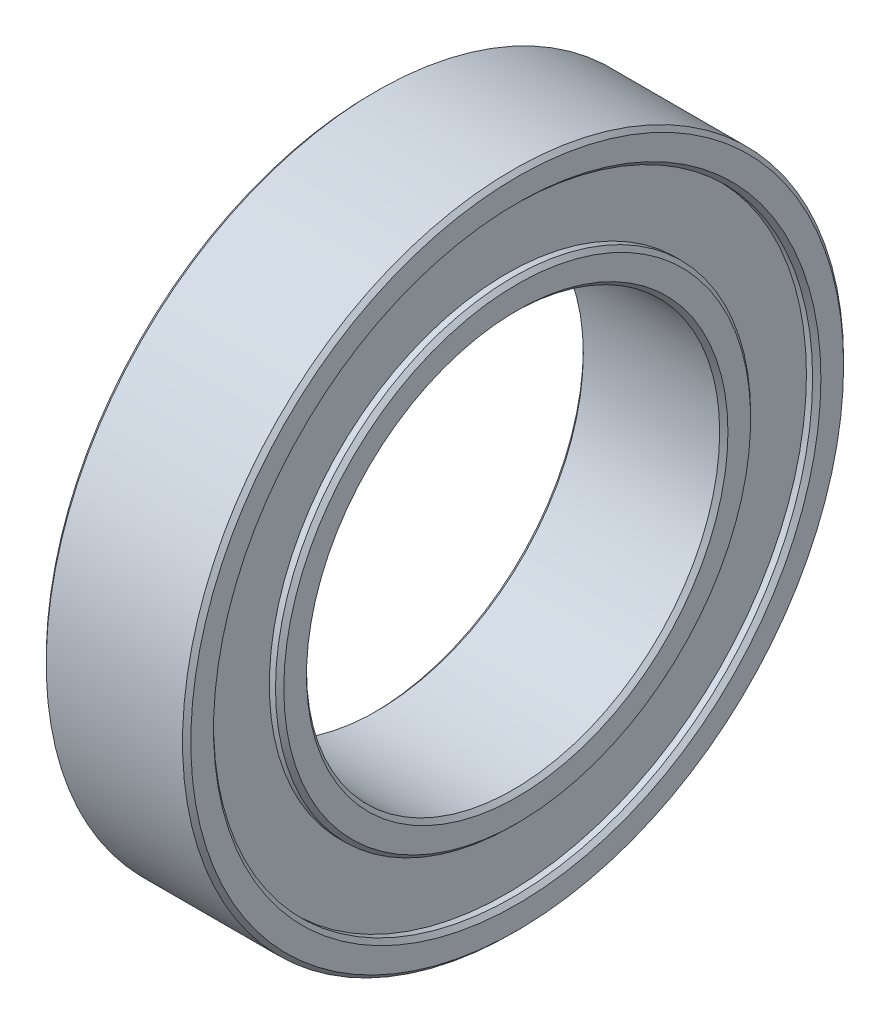
ISO-10303-21;
HEADER;
FILE_DESCRIPTION(('STEP AP214'),'2;1');
FILE_NAME('part.step','',(''),(''),'','','');
FILE_SCHEMA(('AUTOMOTIVE_DESIGN { 1 0 10303 214 1 1 1 1 }'));
ENDSEC;
DATA;
#1=APPLICATION_CONTEXT('core data for automotive mechanical design processes');
#2=APPLICATION_PROTOCOL_DEFINITION('international standard','automotive_design',2000,#1);
#3=PRODUCT_CONTEXT('',#1,'mechanical');
#4=PRODUCT('Part','Part','',(#3));
#5=PRODUCT_RELATED_PRODUCT_CATEGORY('part','',(#4));
#6=PRODUCT_DEFINITION_FORMATION('','',#4);
#7=PRODUCT_DEFINITION_CONTEXT('part definition',#1,'design');
#8=PRODUCT_DEFINITION('design','',#6,#7);
#9=PRODUCT_DEFINITION_SHAPE('','',#8);
#10=(LENGTH_UNIT() NAMED_UNIT(*) SI_UNIT(.MILLI.,.METRE.));
#11=(NAMED_UNIT(*) PLANE_ANGLE_UNIT() SI_UNIT($,.RADIAN.));
#12=(NAMED_UNIT(*) SI_UNIT($,.STERADIAN.) SOLID_ANGLE_UNIT());
#13=UNCERTAINTY_MEASURE_WITH_UNIT(LENGTH_MEASURE(1.E-05),#10,'distance_accuracy_value','');
#14=(GEOMETRIC_REPRESENTATION_CONTEXT(3) GLOBAL_UNCERTAINTY_ASSIGNED_CONTEXT((#13)) GLOBAL_UNIT_ASSIGNED_CONTEXT((#10,
#11,#12)) REPRESENTATION_CONTEXT('',''));
#15=CARTESIAN_POINT('',(0.,0.,0.));
#16=DIRECTION('',(0.,0.,1.));
#17=DIRECTION('',(1.,0.,0.));
#18=AXIS2_PLACEMENT_3D('',#15,#16,#17);
#19=CARTESIAN_POINT('',(-3.5,0.,0.));
#20=DIRECTION('',(1.,0.,0.));
#21=DIRECTION('',(0.,0.,-1.));
#22=AXIS2_PLACEMENT_3D('',#19,#20,#21);
#23=PLANE('',#22);
#24=CARTESIAN_POINT('',(-3.5,0.,0.));
#25=DIRECTION('',(1.,0.,0.));
#26=DIRECTION('',(0.,0.,-1.));
#27=AXIS2_PLACEMENT_3D('',#24,#25,#26);
#28=CIRCLE('',#27,11.3);
#29=CARTESIAN_POINT('',(-3.5,0.,-11.3));
#30=VERTEX_POINT('',#29);
#31=EDGE_CURVE('E100',#30,#30,#28,.F.);
#32=ORIENTED_EDGE('',*,*,#31,.T.);
#33=EDGE_LOOP('',(#32));
#34=FACE_BOUND('',#33,.T.);
#35=CARTESIAN_POINT('',(-3.5,0.,0.));
#36=DIRECTION('',(1.,0.,0.));
#37=DIRECTION('',(0.,0.,-1.));
#38=AXIS2_PLACEMENT_3D('',#35,#36,#37);
#39=CIRCLE('',#38,10.2);
#40=CARTESIAN_POINT('',(-3.5,0.,-10.2));
#41=VERTEX_POINT('',#40);
#42=EDGE_CURVE('E104',#41,#41,#39,.T.);
#43=ORIENTED_EDGE('',*,*,#42,.T.);
#44=EDGE_LOOP('',(#43));
#45=FACE_BOUND('',#44,.T.);
#46=ADVANCED_FACE('F39',(#34,#45),#23,.F.);
#47=CARTESIAN_POINT('',(3.5,0.,0.));
#48=DIRECTION('',(1.,0.,0.));
#49=DIRECTION('',(0.,0.,-1.));
#50=AXIS2_PLACEMENT_3D('',#47,#48,#49);
#51=PLANE('',#50);
#52=CARTESIAN_POINT('',(3.5,0.,0.));
#53=DIRECTION('',(1.,0.,0.));
#54=DIRECTION('',(0.,0.,-1.));
#55=AXIS2_PLACEMENT_3D('',#52,#53,#54);
#56=CIRCLE('',#55,11.3);
#57=CARTESIAN_POINT('',(3.5,0.,11.3));
#58=VERTEX_POINT('',#57);
#59=EDGE_CURVE('E64',#58,#58,#56,.T.);
#60=ORIENTED_EDGE('',*,*,#59,.T.);
#61=EDGE_LOOP('',(#60));
#62=FACE_BOUND('',#61,.T.);
#63=CARTESIAN_POINT('',(3.5,0.,0.));
#64=DIRECTION('',(1.,0.,0.));
#65=DIRECTION('',(0.,0.,-1.));
#66=AXIS2_PLACEMENT_3D('',#63,#64,#65);
#67=CIRCLE('',#66,10.2);
#68=CARTESIAN_POINT('',(3.5,0.,-10.2));
#69=VERTEX_POINT('',#68);
#70=EDGE_CURVE('E68',#69,#69,#67,.F.);
#71=ORIENTED_EDGE('',*,*,#70,.T.);
#72=EDGE_LOOP('',(#71));
#73=FACE_BOUND('',#72,.T.);
#74=ADVANCED_FACE('F148',(#62,#73),#51,.T.);
#75=CARTESIAN_POINT('',(3.5,0.,0.));
#76=DIRECTION('',(1.,0.,0.));
#77=DIRECTION('',(0.,0.,-1.));
#78=AXIS2_PLACEMENT_3D('',#75,#76,#77);
#79=CIRCLE('',#78,15.8);
#80=CARTESIAN_POINT('',(3.5,0.,-15.8));
#81=VERTEX_POINT('',#80);
#82=EDGE_CURVE('E48',#81,#81,#79,.T.);
#83=ORIENTED_EDGE('',*,*,#82,.T.);
#84=EDGE_LOOP('',(#83));
#85=FACE_BOUND('',#84,.T.);
#86=CARTESIAN_POINT('',(3.5,0.,0.));
#87=DIRECTION('',(1.,0.,0.));
#88=DIRECTION('',(0.,0.,-1.));
#89=AXIS2_PLACEMENT_3D('',#86,#87,#88);
#90=CIRCLE('',#89,14.7);
#91=CARTESIAN_POINT('',(3.5,0.,-14.7));
#92=VERTEX_POINT('',#91);
#93=EDGE_CURVE('E53',#92,#92,#90,.F.);
#94=ORIENTED_EDGE('',*,*,#93,.T.);
#95=EDGE_LOOP('',(#94));
#96=FACE_BOUND('',#95,.T.);
#97=ADVANCED_FACE('F155',(#85,#96),#51,.T.);
#98=CARTESIAN_POINT('',(-3.5,0.,0.));
#99=DIRECTION('',(1.,0.,0.));
#100=DIRECTION('',(0.,0.,-1.));
#101=AXIS2_PLACEMENT_3D('',#98,#99,#100);
#102=CIRCLE('',#101,15.8);
#103=CARTESIAN_POINT('',(-3.5,0.,-15.8));
#104=VERTEX_POINT('',#103);
#105=EDGE_CURVE('E76',#104,#104,#102,.F.);
#106=ORIENTED_EDGE('',*,*,#105,.T.);
#107=EDGE_LOOP('',(#106));
#108=FACE_BOUND('',#107,.T.);
#109=CARTESIAN_POINT('',(-3.5,0.,0.));
#110=DIRECTION('',(1.,0.,0.));
#111=DIRECTION('',(0.,0.,-1.));
#112=AXIS2_PLACEMENT_3D('',#109,#110,#111);
#113=CIRCLE('',#112,14.7);
#114=CARTESIAN_POINT('',(-3.5,0.,-14.7));
#115=VERTEX_POINT('',#114);
#116=EDGE_CURVE('E80',#115,#115,#113,.T.);
#117=ORIENTED_EDGE('',*,*,#116,.T.);
#118=EDGE_LOOP('',(#117));
#119=FACE_BOUND('',#118,.T.);
#120=ADVANCED_FACE('F151',(#108,#119),#23,.F.);
#121=CARTESIAN_POINT('',(3.5,0.,0.));
#122=DIRECTION('',(-1.,0.,0.));
#123=DIRECTION('',(0.,0.,1.));
#124=AXIS2_PLACEMENT_3D('',#121,#122,#123);
#125=CYLINDRICAL_SURFACE('',#124,16.);
#126=CARTESIAN_POINT('',(-3.3,0.,0.));
#127=DIRECTION('',(1.,0.,0.));
#128=DIRECTION('',(0.,0.,-1.));
#129=AXIS2_PLACEMENT_3D('',#126,#127,#128);
#130=CIRCLE('',#129,16.);
#131=CARTESIAN_POINT('',(-3.3,0.,-16.));
#132=VERTEX_POINT('',#131);
#133=EDGE_CURVE('E84',#132,#132,#130,.T.);
#134=ORIENTED_EDGE('',*,*,#133,.T.);
#135=EDGE_LOOP('',(#134));
#136=FACE_BOUND('',#135,.T.);
#137=CARTESIAN_POINT('',(3.29999999999999,0.,0.));
#138=DIRECTION('',(1.,0.,0.));
#139=DIRECTION('',(0.,0.,-1.));
#140=AXIS2_PLACEMENT_3D('',#137,#138,#139);
#141=CIRCLE('',#140,16.);
#142=CARTESIAN_POINT('',(3.29999999999999,0.,-16.));
#143=VERTEX_POINT('',#142);
#144=EDGE_CURVE('E88',#143,#143,#141,.F.);
#145=ORIENTED_EDGE('',*,*,#144,.T.);
#146=EDGE_LOOP('',(#145));
#147=FACE_BOUND('',#146,.T.);
#148=ADVANCED_FACE('F161',(#136,#147),#125,.T.);
#149=CARTESIAN_POINT('',(3.5,0.,0.));
#150=DIRECTION('',(-1.,0.,0.));
#151=DIRECTION('',(0.,0.,1.));
#152=AXIS2_PLACEMENT_3D('',#149,#150,#151);
#153=CYLINDRICAL_SURFACE('',#152,10.);
#154=CARTESIAN_POINT('',(-3.3,0.,0.));
#155=DIRECTION('',(1.,0.,0.));
#156=DIRECTION('',(0.,0.,-1.));
#157=AXIS2_PLACEMENT_3D('',#154,#155,#156);
#158=CIRCLE('',#157,10.);
#159=CARTESIAN_POINT('',(-3.3,0.,-10.));
#160=VERTEX_POINT('',#159);
#161=EDGE_CURVE('E92',#160,#160,#158,.F.);
#162=ORIENTED_EDGE('',*,*,#161,.T.);
#163=EDGE_LOOP('',(#162));
#164=FACE_BOUND('',#163,.T.);
#165=CARTESIAN_POINT('',(3.29999999999999,0.,0.));
#166=DIRECTION('',(1.,0.,0.));
#167=DIRECTION('',(0.,0.,-1.));
#168=AXIS2_PLACEMENT_3D('',#165,#166,#167);
#169=CIRCLE('',#168,10.);
#170=CARTESIAN_POINT('',(3.29999999999999,0.,-10.));
#171=VERTEX_POINT('',#170);
#172=EDGE_CURVE('E96',#171,#171,#169,.T.);
#173=ORIENTED_EDGE('',*,*,#172,.T.);
#174=EDGE_LOOP('',(#173));
#175=FACE_BOUND('',#174,.T.);
#176=ADVANCED_FACE('F167',(#164,#175),#153,.F.);
#177=CARTESIAN_POINT('',(3.,0.,0.));
#178=DIRECTION('',(1.,0.,0.));
#179=DIRECTION('',(0.,0.,-1.));
#180=AXIS2_PLACEMENT_3D('',#177,#178,#179);
#181=CYLINDRICAL_SURFACE('',#180,14.5);
#182=CARTESIAN_POINT('',(3.3,0.,0.));
#183=DIRECTION('',(1.,0.,0.));
#184=DIRECTION('',(0.,0.,-1.));
#185=AXIS2_PLACEMENT_3D('',#182,#183,#184);
#186=CIRCLE('',#185,14.5);
#187=CARTESIAN_POINT('',(3.3,0.,-14.5));
#188=VERTEX_POINT('',#187);
#189=EDGE_CURVE('E10',#188,#188,#186,.T.);
#190=ORIENTED_EDGE('',*,*,#189,.T.);
#191=EDGE_LOOP('',(#190));
#192=FACE_BOUND('',#191,.T.);
#193=CARTESIAN_POINT('',(3.,0.,0.));
#194=DIRECTION('',(1.,0.,0.));
#195=DIRECTION('',(0.,0.,-1.));
#196=AXIS2_PLACEMENT_3D('',#193,#194,#195);
#197=CIRCLE('',#196,14.5);
#198=CARTESIAN_POINT('',(3.,0.,-14.5));
#199=VERTEX_POINT('',#198);
#200=EDGE_CURVE('E112',#199,#199,#197,.T.);
#201=ORIENTED_EDGE('',*,*,#200,.F.);
#202=EDGE_LOOP('',(#201));
#203=FACE_BOUND('',#202,.T.);
#204=ADVANCED_FACE('F292',(#192,#203),#181,.F.);
#205=CARTESIAN_POINT('',(3.,0.,0.));
#206=DIRECTION('',(1.,0.,0.));
#207=DIRECTION('',(0.,0.,-1.));
#208=AXIS2_PLACEMENT_3D('',#205,#206,#207);
#209=PLANE('',#208);
#210=CARTESIAN_POINT('',(3.,0.,0.));
#211=DIRECTION('',(1.,0.,0.));
#212=DIRECTION('',(0.,0.,-1.));
#213=AXIS2_PLACEMENT_3D('',#210,#211,#212);
#214=CIRCLE('',#213,11.5);
#215=CARTESIAN_POINT('',(3.,0.,-11.5));
#216=VERTEX_POINT('',#215);
#217=EDGE_CURVE('E116',#216,#216,#214,.T.);
#218=ORIENTED_EDGE('',*,*,#217,.F.);
#219=EDGE_LOOP('',(#218));
#220=FACE_BOUND('',#219,.T.);
#221=ORIENTED_EDGE('',*,*,#200,.T.);
#222=EDGE_LOOP('',(#221));
#223=FACE_BOUND('',#222,.T.);
#224=ADVANCED_FACE('F283',(#220,#223),#209,.T.);
#225=CARTESIAN_POINT('',(3.,0.,0.));
#226=DIRECTION('',(1.,0.,0.));
#227=DIRECTION('',(0.,0.,-1.));
#228=AXIS2_PLACEMENT_3D('',#225,#226,#227);
#229=CYLINDRICAL_SURFACE('',#228,11.5);
#230=CARTESIAN_POINT('',(3.29999999999999,0.,0.));
#231=DIRECTION('',(1.,0.,0.));
#232=DIRECTION('',(0.,0.,-1.));
#233=AXIS2_PLACEMENT_3D('',#230,#231,#232);
#234=CIRCLE('',#233,11.5);
#235=CARTESIAN_POINT('',(3.29999999999999,0.,11.5));
#236=VERTEX_POINT('',#235);
#237=EDGE_CURVE('E58',#236,#236,#234,.F.);
#238=ORIENTED_EDGE('',*,*,#237,.T.);
#239=EDGE_LOOP('',(#238));
#240=FACE_BOUND('',#239,.T.);
#241=ORIENTED_EDGE('',*,*,#217,.T.);
#242=EDGE_LOOP('',(#241));
#243=FACE_BOUND('',#242,.T.);
#244=ADVANCED_FACE('F278',(#240,#243),#229,.T.);
#245=CARTESIAN_POINT('',(-3.,0.,0.));
#246=DIRECTION('',(-1.,0.,0.));
#247=DIRECTION('',(0.,0.,-1.));
#248=AXIS2_PLACEMENT_3D('',#245,#246,#247);
#249=PLANE('',#248);
#250=CARTESIAN_POINT('',(-3.,0.,0.));
#251=DIRECTION('',(1.,0.,0.));
#252=DIRECTION('',(0.,0.,-1.));
#253=AXIS2_PLACEMENT_3D('',#250,#251,#252);
#254=CIRCLE('',#253,14.5);
#255=CARTESIAN_POINT('',(-3.,0.,-14.5));
#256=VERTEX_POINT('',#255);
#257=EDGE_CURVE('E120',#256,#256,#254,.T.);
#258=ORIENTED_EDGE('',*,*,#257,.F.);
#259=EDGE_LOOP('',(#258));
#260=FACE_BOUND('',#259,.T.);
#261=CARTESIAN_POINT('',(-3.,0.,0.));
#262=DIRECTION('',(1.,0.,0.));
#263=DIRECTION('',(0.,0.,-1.));
#264=AXIS2_PLACEMENT_3D('',#261,#262,#263);
#265=CIRCLE('',#264,11.5);
#266=CARTESIAN_POINT('',(-3.,0.,-11.5));
#267=VERTEX_POINT('',#266);
#268=EDGE_CURVE('E124',#267,#267,#265,.T.);
#269=ORIENTED_EDGE('',*,*,#268,.T.);
#270=EDGE_LOOP('',(#269));
#271=FACE_BOUND('',#270,.T.);
#272=ADVANCED_FACE('F129',(#260,#271),#249,.T.);
#273=CARTESIAN_POINT('',(-3.,0.,0.));
#274=DIRECTION('',(-1.,0.,0.));
#275=DIRECTION('',(0.,0.,1.));
#276=AXIS2_PLACEMENT_3D('',#273,#274,#275);
#277=CYLINDRICAL_SURFACE('',#276,14.5);
#278=CARTESIAN_POINT('',(-3.3,0.,0.));
#279=DIRECTION('',(1.,0.,0.));
#280=DIRECTION('',(0.,0.,-1.));
#281=AXIS2_PLACEMENT_3D('',#278,#279,#280);
#282=CIRCLE('',#281,14.5);
#283=CARTESIAN_POINT('',(-3.3,0.,-14.5));
#284=VERTEX_POINT('',#283);
#285=EDGE_CURVE('E72',#284,#284,#282,.F.);
#286=ORIENTED_EDGE('',*,*,#285,.T.);
#287=EDGE_LOOP('',(#286));
#288=FACE_BOUND('',#287,.T.);
#289=ORIENTED_EDGE('',*,*,#257,.T.);
#290=EDGE_LOOP('',(#289));
#291=FACE_BOUND('',#290,.T.);
#292=ADVANCED_FACE('F134',(#288,#291),#277,.F.);
#293=CARTESIAN_POINT('',(-3.,0.,0.));
#294=DIRECTION('',(-1.,0.,0.));
#295=DIRECTION('',(0.,0.,1.));
#296=AXIS2_PLACEMENT_3D('',#293,#294,#295);
#297=CYLINDRICAL_SURFACE('',#296,11.5);
#298=CARTESIAN_POINT('',(-3.3,0.,0.));
#299=DIRECTION('',(1.,0.,0.));
#300=DIRECTION('',(0.,0.,-1.));
#301=AXIS2_PLACEMENT_3D('',#298,#299,#300);
#302=CIRCLE('',#301,11.5);
#303=CARTESIAN_POINT('',(-3.3,0.,-11.5));
#304=VERTEX_POINT('',#303);
#305=EDGE_CURVE('E108',#304,#304,#302,.T.);
#306=ORIENTED_EDGE('',*,*,#305,.T.);
#307=EDGE_LOOP('',(#306));
#308=FACE_BOUND('',#307,.T.);
#309=ORIENTED_EDGE('',*,*,#268,.F.);
#310=EDGE_LOOP('',(#309));
#311=FACE_BOUND('',#310,.T.);
#312=ADVANCED_FACE('F131',(#308,#311),#297,.T.);
#313=CARTESIAN_POINT('',(-3.3,0.,0.));
#314=DIRECTION('',(1.,0.,0.));
#315=DIRECTION('',(0.,0.,-1.));
#316=AXIS2_PLACEMENT_3D('',#313,#314,#315);
#317=CONICAL_SURFACE('',#316,11.5,0.785398163397453);
#318=ORIENTED_EDGE('',*,*,#31,.F.);
#319=EDGE_LOOP('',(#318));
#320=FACE_BOUND('',#319,.T.);
#321=ORIENTED_EDGE('',*,*,#305,.F.);
#322=EDGE_LOOP('',(#321));
#323=FACE_BOUND('',#322,.T.);
#324=ADVANCED_FACE('F133',(#320,#323),#317,.T.);
#325=CARTESIAN_POINT('',(-3.5,0.,0.));
#326=DIRECTION('',(-1.,0.,0.));
#327=DIRECTION('',(0.,0.,1.));
#328=AXIS2_PLACEMENT_3D('',#325,#326,#327);
#329=CONICAL_SURFACE('',#328,10.2,0.785398163397448);
#330=ORIENTED_EDGE('',*,*,#161,.F.);
#331=EDGE_LOOP('',(#330));
#332=FACE_BOUND('',#331,.T.);
#333=ORIENTED_EDGE('',*,*,#42,.F.);
#334=EDGE_LOOP('',(#333));
#335=FACE_BOUND('',#334,.T.);
#336=ADVANCED_FACE('F141',(#332,#335),#329,.F.);
#337=CARTESIAN_POINT('',(-3.3,0.,0.));
#338=DIRECTION('',(1.,0.,0.));
#339=DIRECTION('',(0.,0.,-1.));
#340=AXIS2_PLACEMENT_3D('',#337,#338,#339);
#341=CONICAL_SURFACE('',#340,16.,0.785398163397448);
#342=ORIENTED_EDGE('',*,*,#105,.F.);
#343=EDGE_LOOP('',(#342));
#344=FACE_BOUND('',#343,.T.);
#345=ORIENTED_EDGE('',*,*,#133,.F.);
#346=EDGE_LOOP('',(#345));
#347=FACE_BOUND('',#346,.T.);
#348=ADVANCED_FACE('F176',(#344,#347),#341,.T.);
#349=CARTESIAN_POINT('',(-3.5,0.,0.));
#350=DIRECTION('',(-1.,0.,0.));
#351=DIRECTION('',(0.,0.,1.));
#352=AXIS2_PLACEMENT_3D('',#349,#350,#351);
#353=CONICAL_SURFACE('',#352,14.7,0.785398163397457);
#354=ORIENTED_EDGE('',*,*,#285,.F.);
#355=EDGE_LOOP('',(#354));
#356=FACE_BOUND('',#355,.T.);
#357=ORIENTED_EDGE('',*,*,#116,.F.);
#358=EDGE_LOOP('',(#357));
#359=FACE_BOUND('',#358,.T.);
#360=ADVANCED_FACE('F173',(#356,#359),#353,.F.);
#361=CARTESIAN_POINT('',(3.5,0.,0.));
#362=DIRECTION('',(-1.,0.,0.));
#363=DIRECTION('',(0.,0.,1.));
#364=AXIS2_PLACEMENT_3D('',#361,#362,#363);
#365=CONICAL_SURFACE('',#364,11.3,0.785398163397444);
#366=CARTESIAN_POINT('',(3.29999999999999,0.,11.5));
#367=CARTESIAN_POINT('',(3.30208333333332,0.,11.4979166666667));
#368=CARTESIAN_POINT('',(3.30416666666666,0.,11.4958333333333));
#369=CARTESIAN_POINT('',(3.30833333333332,0.,11.4916666666667));
#370=CARTESIAN_POINT('',(3.31041666666666,0.,11.4895833333333));
#371=CARTESIAN_POINT('',(3.31458333333332,0.,11.4854166666667));
#372=CARTESIAN_POINT('',(3.31666666666666,0.,11.4833333333333));
#373=CARTESIAN_POINT('',(3.32083333333332,0.,11.4791666666667));
#374=CARTESIAN_POINT('',(3.32291666666666,0.,11.4770833333333));
#375=CARTESIAN_POINT('',(3.32708333333332,0.,11.4729166666667));
#376=CARTESIAN_POINT('',(3.32916666666666,0.,11.4708333333333));
#377=CARTESIAN_POINT('',(3.33333333333332,0.,11.4666666666667));
#378=CARTESIAN_POINT('',(3.33541666666666,0.,11.4645833333333));
#379=CARTESIAN_POINT('',(3.33958333333332,0.,11.4604166666667));
#380=CARTESIAN_POINT('',(3.34166666666666,0.,11.4583333333333));
#381=CARTESIAN_POINT('',(3.34583333333332,0.,11.4541666666667));
#382=CARTESIAN_POINT('',(3.34791666666666,0.,11.4520833333333));
#383=CARTESIAN_POINT('',(3.35208333333333,0.,11.4479166666667));
#384=CARTESIAN_POINT('',(3.35416666666666,0.,11.4458333333333));
#385=CARTESIAN_POINT('',(3.35833333333332,0.,11.4416666666667));
#386=CARTESIAN_POINT('',(3.36041666666666,0.,11.4395833333333));
#387=CARTESIAN_POINT('',(3.36458333333333,0.,11.4354166666667));
#388=CARTESIAN_POINT('',(3.36666666666666,0.,11.4333333333333));
#389=CARTESIAN_POINT('',(3.37083333333333,0.,11.4291666666667));
#390=CARTESIAN_POINT('',(3.37291666666666,0.,11.4270833333333));
#391=CARTESIAN_POINT('',(3.37708333333333,0.,11.4229166666667));
#392=CARTESIAN_POINT('',(3.37916666666666,0.,11.4208333333333));
#393=CARTESIAN_POINT('',(3.38333333333333,0.,11.4166666666667));
#394=CARTESIAN_POINT('',(3.38541666666666,0.,11.4145833333333));
#395=CARTESIAN_POINT('',(3.38958333333333,0.,11.4104166666667));
#396=CARTESIAN_POINT('',(3.39166666666666,0.,11.4083333333333));
#397=CARTESIAN_POINT('',(3.39583333333333,0.,11.4041666666667));
#398=CARTESIAN_POINT('',(3.39791666666666,0.,11.4020833333333));
#399=CARTESIAN_POINT('',(3.40208333333333,0.,11.3979166666667));
#400=CARTESIAN_POINT('',(3.40416666666666,0.,11.3958333333333));
#401=CARTESIAN_POINT('',(3.40833333333333,0.,11.3916666666667));
#402=CARTESIAN_POINT('',(3.41041666666666,0.,11.3895833333333));
#403=CARTESIAN_POINT('',(3.41458333333333,0.,11.3854166666667));
#404=CARTESIAN_POINT('',(3.41666666666666,0.,11.3833333333333));
#405=CARTESIAN_POINT('',(3.42083333333333,0.,11.3791666666667));
#406=CARTESIAN_POINT('',(3.42291666666666,0.,11.3770833333333));
#407=CARTESIAN_POINT('',(3.42708333333333,0.,11.3729166666667));
#408=CARTESIAN_POINT('',(3.42916666666666,0.,11.3708333333333));
#409=CARTESIAN_POINT('',(3.43333333333333,0.,11.3666666666667));
#410=CARTESIAN_POINT('',(3.43541666666666,0.,11.3645833333333));
#411=CARTESIAN_POINT('',(3.43958333333333,0.,11.3604166666667));
#412=CARTESIAN_POINT('',(3.44166666666666,0.,11.3583333333333));
#413=CARTESIAN_POINT('',(3.44583333333333,0.,11.3541666666667));
#414=CARTESIAN_POINT('',(3.44791666666666,0.,11.3520833333333));
#415=CARTESIAN_POINT('',(3.45208333333333,0.,11.3479166666667));
#416=CARTESIAN_POINT('',(3.45416666666666,0.,11.3458333333333));
#417=CARTESIAN_POINT('',(3.45833333333333,0.,11.3416666666667));
#418=CARTESIAN_POINT('',(3.46041666666666,0.,11.3395833333333));
#419=CARTESIAN_POINT('',(3.46458333333333,0.,11.3354166666667));
#420=CARTESIAN_POINT('',(3.46666666666666,0.,11.3333333333333));
#421=CARTESIAN_POINT('',(3.47083333333333,0.,11.3291666666667));
#422=CARTESIAN_POINT('',(3.47291666666667,0.,11.3270833333333));
#423=CARTESIAN_POINT('',(3.47708333333333,0.,11.3229166666667));
#424=CARTESIAN_POINT('',(3.47916666666667,0.,11.3208333333333));
#425=CARTESIAN_POINT('',(3.48333333333333,0.,11.3166666666667));
#426=CARTESIAN_POINT('',(3.48541666666667,0.,11.3145833333333));
#427=CARTESIAN_POINT('',(3.48958333333333,0.,11.3104166666667));
#428=CARTESIAN_POINT('',(3.49166666666667,0.,11.3083333333333));
#429=CARTESIAN_POINT('',(3.49583333333333,0.,11.3041666666667));
#430=CARTESIAN_POINT('',(3.49791666666667,0.,11.3020833333333));
#431=CARTESIAN_POINT('',(3.5,0.,11.3));
#432=B_SPLINE_CURVE_WITH_KNOTS('',3,(#366,#367,#368,#369,#370,#371,#372,#373,#374,#375,#376,
#377,#378,#379,#380,#381,#382,#383,#384,#385,#386,#387,#388,#389,#390,#391,#392,#393,#394,#395,
#396,#397,#398,#399,#400,#401,#402,#403,#404,#405,#406,#407,#408,#409,#410,#411,#412,#413,#414,
#415,#416,#417,#418,#419,#420,#421,#422,#423,#424,#425,#426,#427,#428,#429,#430,#431),
.UNSPECIFIED.,.F.,.F.,(4,2,2,2,2,2,2,2,2,2,2,2,2,2,2,2,2,2,2,2,2,2,2,2,2,2,2,2,2,2,2,2,4),(0.,
0.00883883476483148,0.0176776695296642,0.0265165042944972,0.0353553390593287,0.0441941738241614,
0.0530330085889932,0.0618718433538259,0.0707106781186577,0.0795495128834904,0.0883883476483231,
0.0972271824131549,0.106066017177988,0.114904851942819,0.123743686707652,0.132582521472484,
0.141421356237317,0.150260191002148,0.159099025766981,0.167937860531814,0.176776695296645,
0.185615530061478,0.19445436482631,0.203293199591143,0.212132034355974,0.220970869120807,
0.229809703885639,0.238648538650472,0.247487373415304,0.256326208180136,0.265165042944969,
0.2740038777098,0.282842712474633),.UNSPECIFIED.);
#433=EDGE_CURVE('BSEAM175',#236,#58,#432,.T.);
#434=ORIENTED_EDGE('',*,*,#237,.F.);
#435=ORIENTED_EDGE('',*,*,#59,.F.);
#436=ORIENTED_EDGE('',*,*,#433,.T.);
#437=ORIENTED_EDGE('',*,*,#433,.F.);
#438=EDGE_LOOP('',(#434,#436,#435,#437));
#439=FACE_BOUND('',#438,.T.);
#440=ADVANCED_FACE('F175',(#439),#365,.T.);
#441=CARTESIAN_POINT('',(3.29999999999999,0.,0.));
#442=DIRECTION('',(1.,0.,0.));
#443=DIRECTION('',(0.,0.,-1.));
#444=AXIS2_PLACEMENT_3D('',#441,#442,#443);
#445=CONICAL_SURFACE('',#444,10.,0.785398163397453);
#446=ORIENTED_EDGE('',*,*,#70,.F.);
#447=EDGE_LOOP('',(#446));
#448=FACE_BOUND('',#447,.T.);
#449=ORIENTED_EDGE('',*,*,#172,.F.);
#450=EDGE_LOOP('',(#449));
#451=FACE_BOUND('',#450,.T.);
#452=ADVANCED_FACE('F183',(#448,#451),#445,.F.);
#453=CARTESIAN_POINT('',(3.5,0.,0.));
#454=DIRECTION('',(-1.,0.,0.));
#455=DIRECTION('',(0.,0.,1.));
#456=AXIS2_PLACEMENT_3D('',#453,#454,#455);
#457=CONICAL_SURFACE('',#456,15.8,0.785398163397448);
#458=ORIENTED_EDGE('',*,*,#144,.F.);
#459=EDGE_LOOP('',(#458));
#460=FACE_BOUND('',#459,.T.);
#461=ORIENTED_EDGE('',*,*,#82,.F.);
#462=EDGE_LOOP('',(#461));
#463=FACE_BOUND('',#462,.T.);
#464=ADVANCED_FACE('F203',(#460,#463),#457,.T.);
#465=CARTESIAN_POINT('',(3.3,0.,0.));
#466=DIRECTION('',(1.,0.,0.));
#467=DIRECTION('',(0.,0.,-1.));
#468=AXIS2_PLACEMENT_3D('',#465,#466,#467);
#469=CONICAL_SURFACE('',#468,14.5,0.78539816339744);
#470=ORIENTED_EDGE('',*,*,#93,.F.);
#471=EDGE_LOOP('',(#470));
#472=FACE_BOUND('',#471,.T.);
#473=ORIENTED_EDGE('',*,*,#189,.F.);
#474=EDGE_LOOP('',(#473));
#475=FACE_BOUND('',#474,.T.);
#476=ADVANCED_FACE('F42',(#472,#475),#469,.F.);
#477=CLOSED_SHELL('',(#46,#74,#97,#120,#148,#176,#204,#224,#244,#272,#292,#312,#324,#336,#348,
#360,#440,#452,#464,#476));
#478=MANIFOLD_SOLID_BREP('B2',#477);
#479=ADVANCED_BREP_SHAPE_REPRESENTATION('',(#18,#478),#14);
#480=SHAPE_DEFINITION_REPRESENTATION(#9,#479);
ENDSEC;
END-ISO-10303-21;
